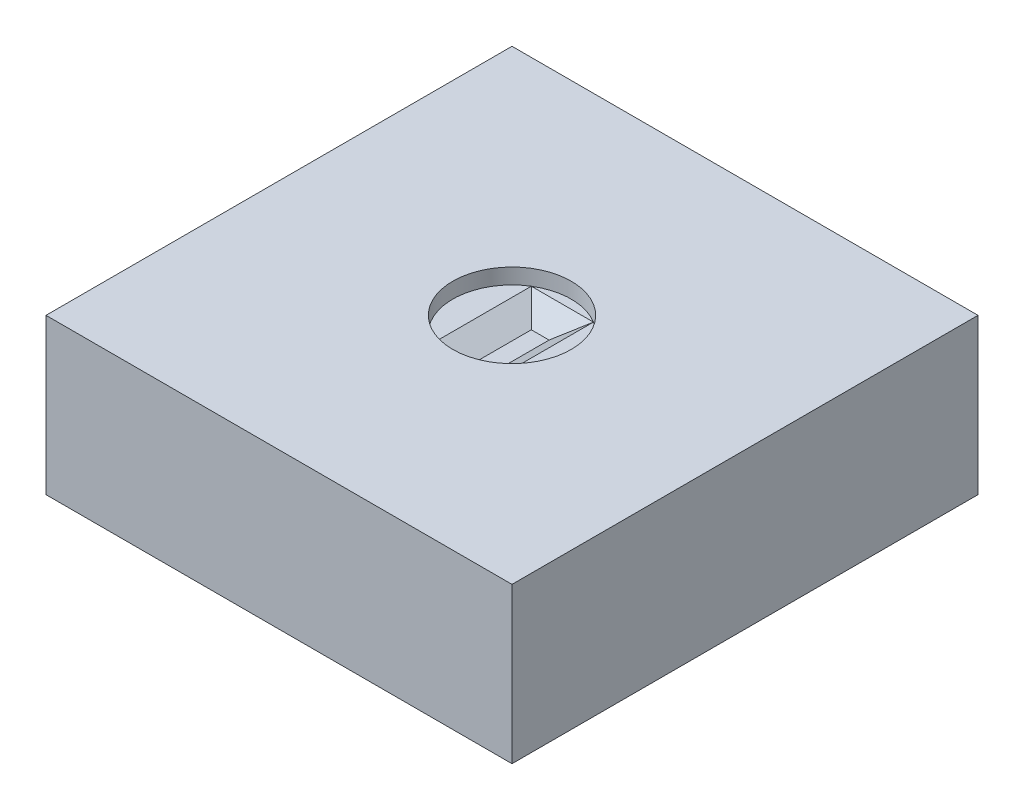
ISO-10303-21;
HEADER;
FILE_DESCRIPTION(('STEP AP214'),'2;1');
FILE_NAME('part.step','',(''),(''),'','','');
FILE_SCHEMA(('AUTOMOTIVE_DESIGN { 1 0 10303 214 1 1 1 1 }'));
ENDSEC;
DATA;
#1=APPLICATION_CONTEXT('core data for automotive mechanical design processes');
#2=APPLICATION_PROTOCOL_DEFINITION('international standard','automotive_design',2000,#1);
#3=PRODUCT_CONTEXT('',#1,'mechanical');
#4=PRODUCT('Part','Part','',(#3));
#5=PRODUCT_RELATED_PRODUCT_CATEGORY('part','',(#4));
#6=PRODUCT_DEFINITION_FORMATION('','',#4);
#7=PRODUCT_DEFINITION_CONTEXT('part definition',#1,'design');
#8=PRODUCT_DEFINITION('design','',#6,#7);
#9=PRODUCT_DEFINITION_SHAPE('','',#8);
#10=(LENGTH_UNIT() NAMED_UNIT(*) SI_UNIT(.MILLI.,.METRE.));
#11=(NAMED_UNIT(*) PLANE_ANGLE_UNIT() SI_UNIT($,.RADIAN.));
#12=(NAMED_UNIT(*) SI_UNIT($,.STERADIAN.) SOLID_ANGLE_UNIT());
#13=UNCERTAINTY_MEASURE_WITH_UNIT(LENGTH_MEASURE(1.E-05),#10,'distance_accuracy_value','');
#14=(GEOMETRIC_REPRESENTATION_CONTEXT(3) GLOBAL_UNCERTAINTY_ASSIGNED_CONTEXT((#13)) GLOBAL_UNIT_ASSIGNED_CONTEXT((#10,
#11,#12)) REPRESENTATION_CONTEXT('',''));
#15=CARTESIAN_POINT('',(0.,0.,0.));
#16=DIRECTION('',(0.,0.,1.));
#17=DIRECTION('',(1.,0.,0.));
#18=AXIS2_PLACEMENT_3D('',#15,#16,#17);
#19=CARTESIAN_POINT('',(0.,9.,0.));
#20=DIRECTION('',(0.,1.,0.));
#21=DIRECTION('',(0.,0.,1.));
#22=AXIS2_PLACEMENT_3D('',#19,#20,#21);
#23=PLANE('',#22);
#24=DIRECTION('',(0.,0.,1.));
#25=VECTOR('',#24,1.);
#26=CARTESIAN_POINT('',(-2.,9.,-3.24285368155888));
#27=LINE('',#26,#25);
#28=CARTESIAN_POINT('',(-2.,9.,-3.24285368155888));
#29=VERTEX_POINT('',#28);
#30=CARTESIAN_POINT('',(-2.,9.,3.24285368155888));
#31=VERTEX_POINT('',#30);
#32=EDGE_CURVE('E117',#29,#31,#27,.T.);
#33=ORIENTED_EDGE('',*,*,#32,.F.);
#34=CARTESIAN_POINT('',(0.,9.,0.));
#35=DIRECTION('',(0.,1.,0.));
#36=DIRECTION('',(0.,0.,1.));
#37=AXIS2_PLACEMENT_3D('',#34,#35,#36);
#38=CIRCLE('',#37,3.81);
#39=EDGE_CURVE('E136',#29,#31,#38,.T.);
#40=ORIENTED_EDGE('',*,*,#39,.T.);
#41=EDGE_LOOP('',(#33,#40));
#42=FACE_BOUND('',#41,.T.);
#43=ADVANCED_FACE('F34',(#42),#23,.T.);
#44=DIRECTION('',(1.,0.,0.));
#45=VECTOR('',#44,1.);
#46=CARTESIAN_POINT('',(-2.,9.,3.24285368155888));
#47=LINE('',#46,#45);
#48=CARTESIAN_POINT('',(2.,9.,3.24285368155888));
#49=VERTEX_POINT('',#48);
#50=EDGE_CURVE('E107',#31,#49,#47,.T.);
#51=ORIENTED_EDGE('',*,*,#50,.F.);
#52=EDGE_CURVE('E129',#31,#49,#38,.T.);
#53=ORIENTED_EDGE('',*,*,#52,.T.);
#54=EDGE_LOOP('',(#51,#53));
#55=FACE_BOUND('',#54,.T.);
#56=ADVANCED_FACE('F128',(#55),#23,.T.);
#57=DIRECTION('',(0.,0.,-1.));
#58=VECTOR('',#57,1.);
#59=CARTESIAN_POINT('',(2.,9.,-3.24285368155888));
#60=LINE('',#59,#58);
#61=CARTESIAN_POINT('',(2.,9.,-3.24285368155888));
#62=VERTEX_POINT('',#61);
#63=EDGE_CURVE('E49',#49,#62,#60,.T.);
#64=ORIENTED_EDGE('',*,*,#63,.F.);
#65=EDGE_CURVE('E139',#49,#62,#38,.T.);
#66=ORIENTED_EDGE('',*,*,#65,.T.);
#67=EDGE_LOOP('',(#64,#66));
#68=FACE_BOUND('',#67,.T.);
#69=ADVANCED_FACE('F191',(#68),#23,.T.);
#70=CARTESIAN_POINT('',(-15.,10.,0.));
#71=DIRECTION('',(-1.,0.,0.));
#72=DIRECTION('',(0.,0.,1.));
#73=AXIS2_PLACEMENT_3D('',#70,#71,#72);
#74=PLANE('',#73);
#75=DIRECTION('',(0.,0.,-1.));
#76=VECTOR('',#75,1.);
#77=CARTESIAN_POINT('',(-15.,0.,0.));
#78=LINE('',#77,#76);
#79=CARTESIAN_POINT('',(-15.,0.,15.));
#80=VERTEX_POINT('',#79);
#81=CARTESIAN_POINT('',(-15.,0.,-15.));
#82=VERTEX_POINT('',#81);
#83=EDGE_CURVE('E145',#80,#82,#78,.T.);
#84=ORIENTED_EDGE('',*,*,#83,.F.);
#85=DIRECTION('',(0.,-1.,0.));
#86=VECTOR('',#85,1.);
#87=CARTESIAN_POINT('',(-15.,10.,15.));
#88=LINE('',#87,#86);
#89=CARTESIAN_POINT('',(-15.,10.,15.));
#90=VERTEX_POINT('',#89);
#91=EDGE_CURVE('E11',#90,#80,#88,.T.);
#92=ORIENTED_EDGE('',*,*,#91,.F.);
#93=DIRECTION('',(0.,0.,-1.));
#94=VECTOR('',#93,1.);
#95=CARTESIAN_POINT('',(-15.,10.,0.));
#96=LINE('',#95,#94);
#97=CARTESIAN_POINT('',(-15.,10.,-15.));
#98=VERTEX_POINT('',#97);
#99=EDGE_CURVE('E149',#90,#98,#96,.T.);
#100=ORIENTED_EDGE('',*,*,#99,.T.);
#101=DIRECTION('',(0.,-1.,0.));
#102=VECTOR('',#101,1.);
#103=CARTESIAN_POINT('',(-15.,10.,-15.));
#104=LINE('',#103,#102);
#105=EDGE_CURVE('E58',#98,#82,#104,.T.);
#106=ORIENTED_EDGE('',*,*,#105,.T.);
#107=EDGE_LOOP('',(#84,#92,#100,#106));
#108=FACE_BOUND('',#107,.T.);
#109=ADVANCED_FACE('F36',(#108),#74,.T.);
#110=CARTESIAN_POINT('',(0.,10.,15.));
#111=DIRECTION('',(0.,0.,-1.));
#112=DIRECTION('',(-1.,0.,0.));
#113=AXIS2_PLACEMENT_3D('',#110,#111,#112);
#114=PLANE('',#113);
#115=DIRECTION('',(1.,0.,0.));
#116=VECTOR('',#115,1.);
#117=CARTESIAN_POINT('',(0.,0.,15.));
#118=LINE('',#117,#116);
#119=CARTESIAN_POINT('',(15.,0.,15.));
#120=VERTEX_POINT('',#119);
#121=EDGE_CURVE('E159',#80,#120,#118,.T.);
#122=ORIENTED_EDGE('',*,*,#121,.T.);
#123=DIRECTION('',(0.,-1.,0.));
#124=VECTOR('',#123,1.);
#125=CARTESIAN_POINT('',(15.,10.,15.));
#126=LINE('',#125,#124);
#127=CARTESIAN_POINT('',(15.,10.,15.));
#128=VERTEX_POINT('',#127);
#129=EDGE_CURVE('E42',#128,#120,#126,.T.);
#130=ORIENTED_EDGE('',*,*,#129,.F.);
#131=DIRECTION('',(1.,0.,0.));
#132=VECTOR('',#131,1.);
#133=CARTESIAN_POINT('',(0.,10.,15.));
#134=LINE('',#133,#132);
#135=EDGE_CURVE('E151',#90,#128,#134,.T.);
#136=ORIENTED_EDGE('',*,*,#135,.F.);
#137=ORIENTED_EDGE('',*,*,#91,.T.);
#138=EDGE_LOOP('',(#122,#130,#136,#137));
#139=FACE_BOUND('',#138,.T.);
#140=ADVANCED_FACE('F184',(#139),#114,.F.);
#141=CARTESIAN_POINT('',(15.,10.,0.));
#142=DIRECTION('',(-1.,0.,0.));
#143=DIRECTION('',(0.,0.,1.));
#144=AXIS2_PLACEMENT_3D('',#141,#142,#143);
#145=PLANE('',#144);
#146=DIRECTION('',(0.,0.,-1.));
#147=VECTOR('',#146,1.);
#148=CARTESIAN_POINT('',(15.,0.,0.));
#149=LINE('',#148,#147);
#150=CARTESIAN_POINT('',(15.,0.,-15.));
#151=VERTEX_POINT('',#150);
#152=EDGE_CURVE('E161',#120,#151,#149,.T.);
#153=ORIENTED_EDGE('',*,*,#152,.T.);
#154=DIRECTION('',(0.,-1.,0.));
#155=VECTOR('',#154,1.);
#156=CARTESIAN_POINT('',(15.,10.,-15.));
#157=LINE('',#156,#155);
#158=CARTESIAN_POINT('',(15.,10.,-15.));
#159=VERTEX_POINT('',#158);
#160=EDGE_CURVE('E167',#159,#151,#157,.T.);
#161=ORIENTED_EDGE('',*,*,#160,.F.);
#162=DIRECTION('',(0.,0.,-1.));
#163=VECTOR('',#162,1.);
#164=CARTESIAN_POINT('',(15.,10.,0.));
#165=LINE('',#164,#163);
#166=EDGE_CURVE('E154',#128,#159,#165,.T.);
#167=ORIENTED_EDGE('',*,*,#166,.F.);
#168=ORIENTED_EDGE('',*,*,#129,.T.);
#169=EDGE_LOOP('',(#153,#161,#167,#168));
#170=FACE_BOUND('',#169,.T.);
#171=ADVANCED_FACE('F173',(#170),#145,.F.);
#172=CARTESIAN_POINT('',(0.,10.,-15.));
#173=DIRECTION('',(0.,0.,-1.));
#174=DIRECTION('',(-1.,0.,0.));
#175=AXIS2_PLACEMENT_3D('',#172,#173,#174);
#176=PLANE('',#175);
#177=DIRECTION('',(1.,0.,0.));
#178=VECTOR('',#177,1.);
#179=CARTESIAN_POINT('',(0.,0.,-15.));
#180=LINE('',#179,#178);
#181=EDGE_CURVE('E152',#82,#151,#180,.T.);
#182=ORIENTED_EDGE('',*,*,#181,.F.);
#183=ORIENTED_EDGE('',*,*,#105,.F.);
#184=DIRECTION('',(1.,0.,0.));
#185=VECTOR('',#184,1.);
#186=CARTESIAN_POINT('',(0.,10.,-15.));
#187=LINE('',#186,#185);
#188=EDGE_CURVE('E156',#98,#159,#187,.T.);
#189=ORIENTED_EDGE('',*,*,#188,.T.);
#190=ORIENTED_EDGE('',*,*,#160,.T.);
#191=EDGE_LOOP('',(#182,#183,#189,#190));
#192=FACE_BOUND('',#191,.T.);
#193=ADVANCED_FACE('F179',(#192),#176,.T.);
#194=CARTESIAN_POINT('',(0.,10.,0.));
#195=DIRECTION('',(0.,1.,0.));
#196=DIRECTION('',(0.,0.,1.));
#197=AXIS2_PLACEMENT_3D('',#194,#195,#196);
#198=PLANE('',#197);
#199=CARTESIAN_POINT('',(0.,10.,0.));
#200=DIRECTION('',(0.,1.,0.));
#201=DIRECTION('',(0.,0.,1.));
#202=AXIS2_PLACEMENT_3D('',#199,#200,#201);
#203=CIRCLE('',#202,3.81);
#204=CARTESIAN_POINT('',(0.,10.,3.81));
#205=VERTEX_POINT('',#204);
#206=EDGE_CURVE('E140',#205,#205,#203,.T.);
#207=ORIENTED_EDGE('',*,*,#206,.F.);
#208=EDGE_LOOP('',(#207));
#209=FACE_BOUND('',#208,.T.);
#210=ORIENTED_EDGE('',*,*,#99,.F.);
#211=ORIENTED_EDGE('',*,*,#135,.T.);
#212=ORIENTED_EDGE('',*,*,#166,.T.);
#213=ORIENTED_EDGE('',*,*,#188,.F.);
#214=EDGE_LOOP('',(#210,#211,#212,#213));
#215=FACE_BOUND('',#214,.T.);
#216=ADVANCED_FACE('F183',(#209,#215),#198,.T.);
#217=CARTESIAN_POINT('',(0.,0.,0.));
#218=DIRECTION('',(0.,1.,0.));
#219=DIRECTION('',(0.,0.,1.));
#220=AXIS2_PLACEMENT_3D('',#217,#218,#219);
#221=PLANE('',#220);
#222=ORIENTED_EDGE('',*,*,#83,.T.);
#223=ORIENTED_EDGE('',*,*,#181,.T.);
#224=ORIENTED_EDGE('',*,*,#152,.F.);
#225=ORIENTED_EDGE('',*,*,#121,.F.);
#226=EDGE_LOOP('',(#222,#223,#224,#225));
#227=FACE_BOUND('',#226,.T.);
#228=ADVANCED_FACE('F178',(#227),#221,.F.);
#229=CARTESIAN_POINT('',(0.,9.,0.));
#230=DIRECTION('',(0.,1.,0.));
#231=DIRECTION('',(0.,0.,1.));
#232=AXIS2_PLACEMENT_3D('',#229,#230,#231);
#233=CYLINDRICAL_SURFACE('',#232,3.81);
#234=ORIENTED_EDGE('',*,*,#65,.F.);
#235=ORIENTED_EDGE('',*,*,#52,.F.);
#236=ORIENTED_EDGE('',*,*,#39,.F.);
#237=EDGE_CURVE('E142',#62,#29,#38,.T.);
#238=ORIENTED_EDGE('',*,*,#237,.F.);
#239=EDGE_LOOP('',(#234,#235,#236,#238));
#240=FACE_BOUND('',#239,.T.);
#241=ORIENTED_EDGE('',*,*,#206,.T.);
#242=EDGE_LOOP('',(#241));
#243=FACE_BOUND('',#242,.T.);
#244=ADVANCED_FACE('F133',(#240,#243),#233,.F.);
#245=DIRECTION('',(-1.,0.,0.));
#246=VECTOR('',#245,1.);
#247=CARTESIAN_POINT('',(-2.,9.,-3.24285368155888));
#248=LINE('',#247,#246);
#249=EDGE_CURVE('E213',#62,#29,#248,.T.);
#250=ORIENTED_EDGE('',*,*,#249,.F.);
#251=ORIENTED_EDGE('',*,*,#237,.T.);
#252=EDGE_LOOP('',(#250,#251));
#253=FACE_BOUND('',#252,.T.);
#254=ADVANCED_FACE('F194',(#253),#23,.T.);
#255=CARTESIAN_POINT('',(-2.,9.,-3.24285368155888));
#256=DIRECTION('',(-0.573576436351044,-0.819152044288993,0.));
#257=DIRECTION('',(0.819152044288993,-0.573576436351044,0.));
#258=AXIS2_PLACEMENT_3D('',#255,#256,#257);
#259=PLANE('',#258);
#260=ORIENTED_EDGE('',*,*,#32,.T.);
#261=DIRECTION('',(-0.633687274224643,0.443712606279656,0.633687274224642));
#262=VECTOR('',#261,1.);
#263=CARTESIAN_POINT('',(0.604397804843356,7.17638102455187,0.638455876715522));
#264=LINE('',#263,#262);
#265=CARTESIAN_POINT('',(-0.57185199325788,8.,1.81470567481676));
#266=VERTEX_POINT('',#265);
#267=EDGE_CURVE('E103',#266,#31,#264,.T.);
#268=ORIENTED_EDGE('',*,*,#267,.F.);
#269=DIRECTION('',(0.,0.,1.));
#270=VECTOR('',#269,1.);
#271=CARTESIAN_POINT('',(-0.57185199325788,8.,0.));
#272=LINE('',#271,#270);
#273=CARTESIAN_POINT('',(-0.57185199325788,8.,-1.81470567481676));
#274=VERTEX_POINT('',#273);
#275=EDGE_CURVE('E215',#274,#266,#272,.T.);
#276=ORIENTED_EDGE('',*,*,#275,.F.);
#277=DIRECTION('',(-0.633687274224643,0.443712606279656,-0.633687274224642));
#278=VECTOR('',#277,1.);
#279=CARTESIAN_POINT('',(-2.,9.,-3.24285368155888));
#280=LINE('',#279,#278);
#281=EDGE_CURVE('E119',#274,#29,#280,.T.);
#282=ORIENTED_EDGE('',*,*,#281,.T.);
#283=EDGE_LOOP('',(#260,#268,#276,#282));
#284=FACE_BOUND('',#283,.T.);
#285=ADVANCED_FACE('F118',(#284),#259,.F.);
#286=CARTESIAN_POINT('',(-2.,9.,-3.24285368155888));
#287=DIRECTION('',(0.,-0.819152044288993,-0.573576436351044));
#288=DIRECTION('',(0.,0.573576436351044,-0.819152044288993));
#289=AXIS2_PLACEMENT_3D('',#286,#287,#288);
#290=PLANE('',#289);
#291=ORIENTED_EDGE('',*,*,#249,.T.);
#292=ORIENTED_EDGE('',*,*,#281,.F.);
#293=DIRECTION('',(-1.,0.,0.));
#294=VECTOR('',#293,1.);
#295=CARTESIAN_POINT('',(0.,8.,-1.81470567481676));
#296=LINE('',#295,#294);
#297=CARTESIAN_POINT('',(0.57185199325788,8.,-1.81470567481676));
#298=VERTEX_POINT('',#297);
#299=EDGE_CURVE('E114',#298,#274,#296,.T.);
#300=ORIENTED_EDGE('',*,*,#299,.F.);
#301=DIRECTION('',(0.633687274224643,0.443712606279656,-0.633687274224643));
#302=VECTOR('',#301,1.);
#303=CARTESIAN_POINT('',(2.,9.,-3.24285368155888));
#304=LINE('',#303,#302);
#305=EDGE_CURVE('E218',#298,#62,#304,.T.);
#306=ORIENTED_EDGE('',*,*,#305,.T.);
#307=EDGE_LOOP('',(#291,#292,#300,#306));
#308=FACE_BOUND('',#307,.T.);
#309=ADVANCED_FACE('F206',(#308),#290,.F.);
#310=CARTESIAN_POINT('',(2.,9.,-3.24285368155888));
#311=DIRECTION('',(0.573576436351044,-0.819152044288993,0.));
#312=DIRECTION('',(0.819152044288993,0.573576436351044,0.));
#313=AXIS2_PLACEMENT_3D('',#310,#311,#312);
#314=PLANE('',#313);
#315=ORIENTED_EDGE('',*,*,#63,.T.);
#316=ORIENTED_EDGE('',*,*,#305,.F.);
#317=DIRECTION('',(0.,0.,-1.));
#318=VECTOR('',#317,1.);
#319=CARTESIAN_POINT('',(0.57185199325788,8.,0.));
#320=LINE('',#319,#318);
#321=CARTESIAN_POINT('',(0.57185199325788,8.,1.81470567481676));
#322=VERTEX_POINT('',#321);
#323=EDGE_CURVE('E224',#322,#298,#320,.T.);
#324=ORIENTED_EDGE('',*,*,#323,.F.);
#325=DIRECTION('',(0.633687274224643,0.443712606279656,0.633687274224643));
#326=VECTOR('',#325,1.);
#327=CARTESIAN_POINT('',(0.393761753942971,7.87529987195013,1.63661543550185));
#328=LINE('',#327,#326);
#329=EDGE_CURVE('E113',#322,#49,#328,.T.);
#330=ORIENTED_EDGE('',*,*,#329,.T.);
#331=EDGE_LOOP('',(#315,#316,#324,#330));
#332=FACE_BOUND('',#331,.T.);
#333=ADVANCED_FACE('F231',(#332),#314,.F.);
#334=CARTESIAN_POINT('',(-2.,9.,3.24285368155888));
#335=DIRECTION('',(0.,-0.819152044288993,0.573576436351044));
#336=DIRECTION('',(0.,-0.573576436351044,-0.819152044288993));
#337=AXIS2_PLACEMENT_3D('',#334,#335,#336);
#338=PLANE('',#337);
#339=ORIENTED_EDGE('',*,*,#50,.T.);
#340=ORIENTED_EDGE('',*,*,#329,.F.);
#341=DIRECTION('',(1.,0.,0.));
#342=VECTOR('',#341,1.);
#343=CARTESIAN_POINT('',(0.,8.,1.81470567481676));
#344=LINE('',#343,#342);
#345=EDGE_CURVE('E109',#266,#322,#344,.T.);
#346=ORIENTED_EDGE('',*,*,#345,.F.);
#347=ORIENTED_EDGE('',*,*,#267,.T.);
#348=EDGE_LOOP('',(#339,#340,#346,#347));
#349=FACE_BOUND('',#348,.T.);
#350=ADVANCED_FACE('F105',(#349),#338,.F.);
#351=CARTESIAN_POINT('',(0.,8.,0.));
#352=DIRECTION('',(0.,1.,0.));
#353=DIRECTION('',(0.,0.,1.));
#354=AXIS2_PLACEMENT_3D('',#351,#352,#353);
#355=PLANE('',#354);
#356=ORIENTED_EDGE('',*,*,#275,.T.);
#357=ORIENTED_EDGE('',*,*,#345,.T.);
#358=ORIENTED_EDGE('',*,*,#323,.T.);
#359=ORIENTED_EDGE('',*,*,#299,.T.);
#360=EDGE_LOOP('',(#356,#357,#358,#359));
#361=FACE_BOUND('',#360,.T.);
#362=ADVANCED_FACE('F229',(#361),#355,.T.);
#363=CLOSED_SHELL('',(#43,#56,#69,#109,#140,#171,#193,#216,#228,#244,#254,#285,#309,#333,#350,#362));
#364=MANIFOLD_SOLID_BREP('B2',#363);
#365=ADVANCED_BREP_SHAPE_REPRESENTATION('',(#18,#364),#14);
#366=SHAPE_DEFINITION_REPRESENTATION(#9,#365);
ENDSEC;
END-ISO-10303-21;
